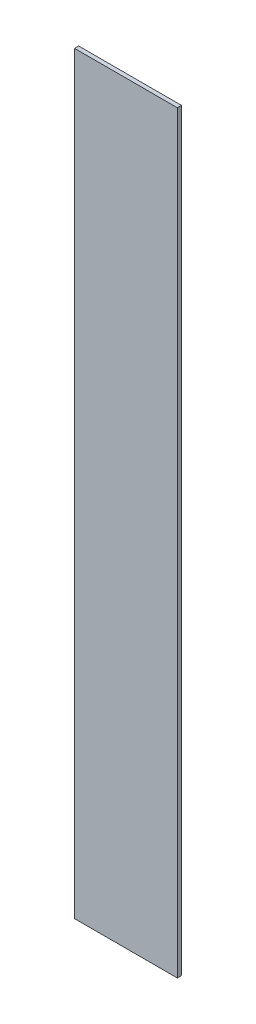
ISO-10303-21;
HEADER;
FILE_DESCRIPTION(('STEP AP214'),'2;1');
FILE_NAME('part.step','',(''),(''),'','','');
FILE_SCHEMA(('AUTOMOTIVE_DESIGN { 1 0 10303 214 1 1 1 1 }'));
ENDSEC;
DATA;
#1=APPLICATION_CONTEXT('core data for automotive mechanical design processes');
#2=APPLICATION_PROTOCOL_DEFINITION('international standard','automotive_design',2000,#1);
#3=PRODUCT_CONTEXT('',#1,'mechanical');
#4=PRODUCT('Part','Part','',(#3));
#5=PRODUCT_RELATED_PRODUCT_CATEGORY('part','',(#4));
#6=PRODUCT_DEFINITION_FORMATION('','',#4);
#7=PRODUCT_DEFINITION_CONTEXT('part definition',#1,'design');
#8=PRODUCT_DEFINITION('design','',#6,#7);
#9=PRODUCT_DEFINITION_SHAPE('','',#8);
#10=(LENGTH_UNIT() NAMED_UNIT(*) SI_UNIT(.MILLI.,.METRE.));
#11=(NAMED_UNIT(*) PLANE_ANGLE_UNIT() SI_UNIT($,.RADIAN.));
#12=(NAMED_UNIT(*) SI_UNIT($,.STERADIAN.) SOLID_ANGLE_UNIT());
#13=UNCERTAINTY_MEASURE_WITH_UNIT(LENGTH_MEASURE(1.E-05),#10,'distance_accuracy_value','');
#14=(GEOMETRIC_REPRESENTATION_CONTEXT(3) GLOBAL_UNCERTAINTY_ASSIGNED_CONTEXT((#13)) GLOBAL_UNIT_ASSIGNED_CONTEXT((#10,
#11,#12)) REPRESENTATION_CONTEXT('',''));
#15=CARTESIAN_POINT('',(0.,0.,0.));
#16=DIRECTION('',(0.,0.,1.));
#17=DIRECTION('',(1.,0.,0.));
#18=AXIS2_PLACEMENT_3D('',#15,#16,#17);
#19=CARTESIAN_POINT('',(15.,110.,1.2));
#20=DIRECTION('',(-1.,0.,0.));
#21=DIRECTION('',(0.,-1.,0.));
#22=AXIS2_PLACEMENT_3D('',#19,#20,#21);
#23=PLANE('',#22);
#24=DIRECTION('',(0.,1.,0.));
#25=VECTOR('',#24,1.);
#26=CARTESIAN_POINT('',(15.,110.,0.));
#27=LINE('',#26,#25);
#28=CARTESIAN_POINT('',(15.,-110.,0.));
#29=VERTEX_POINT('',#28);
#30=CARTESIAN_POINT('',(15.,110.,0.));
#31=VERTEX_POINT('',#30);
#32=EDGE_CURVE('E98',#29,#31,#27,.T.);
#33=ORIENTED_EDGE('',*,*,#32,.T.);
#34=DIRECTION('',(0.,0.,-1.));
#35=VECTOR('',#34,1.);
#36=CARTESIAN_POINT('',(15.,110.,1.2));
#37=LINE('',#36,#35);
#38=CARTESIAN_POINT('',(15.,110.,1.2));
#39=VERTEX_POINT('',#38);
#40=EDGE_CURVE('E11',#39,#31,#37,.T.);
#41=ORIENTED_EDGE('',*,*,#40,.F.);
#42=DIRECTION('',(0.,1.,0.));
#43=VECTOR('',#42,1.);
#44=CARTESIAN_POINT('',(15.,110.,1.2));
#45=LINE('',#44,#43);
#46=CARTESIAN_POINT('',(15.,-110.,1.2));
#47=VERTEX_POINT('',#46);
#48=EDGE_CURVE('E86',#47,#39,#45,.T.);
#49=ORIENTED_EDGE('',*,*,#48,.F.);
#50=DIRECTION('',(0.,0.,-1.));
#51=VECTOR('',#50,1.);
#52=CARTESIAN_POINT('',(15.,-110.,1.2));
#53=LINE('',#52,#51);
#54=EDGE_CURVE('E94',#47,#29,#53,.T.);
#55=ORIENTED_EDGE('',*,*,#54,.T.);
#56=EDGE_LOOP('',(#33,#41,#49,#55));
#57=FACE_BOUND('',#56,.T.);
#58=ADVANCED_FACE('F35',(#57),#23,.F.);
#59=CARTESIAN_POINT('',(-15.,110.,1.2));
#60=DIRECTION('',(0.,-1.,0.));
#61=DIRECTION('',(0.,0.,-1.));
#62=AXIS2_PLACEMENT_3D('',#59,#60,#61);
#63=PLANE('',#62);
#64=DIRECTION('',(-1.,0.,0.));
#65=VECTOR('',#64,1.);
#66=CARTESIAN_POINT('',(-15.,110.,0.));
#67=LINE('',#66,#65);
#68=CARTESIAN_POINT('',(-15.,110.,0.));
#69=VERTEX_POINT('',#68);
#70=EDGE_CURVE('E90',#31,#69,#67,.T.);
#71=ORIENTED_EDGE('',*,*,#70,.T.);
#72=DIRECTION('',(0.,0.,-1.));
#73=VECTOR('',#72,1.);
#74=CARTESIAN_POINT('',(-15.,110.,1.2));
#75=LINE('',#74,#73);
#76=CARTESIAN_POINT('',(-15.,110.,1.2));
#77=VERTEX_POINT('',#76);
#78=EDGE_CURVE('E43',#77,#69,#75,.T.);
#79=ORIENTED_EDGE('',*,*,#78,.F.);
#80=DIRECTION('',(-1.,0.,0.));
#81=VECTOR('',#80,1.);
#82=CARTESIAN_POINT('',(-15.,110.,1.2));
#83=LINE('',#82,#81);
#84=EDGE_CURVE('E81',#39,#77,#83,.T.);
#85=ORIENTED_EDGE('',*,*,#84,.F.);
#86=ORIENTED_EDGE('',*,*,#40,.T.);
#87=EDGE_LOOP('',(#71,#79,#85,#86));
#88=FACE_BOUND('',#87,.T.);
#89=ADVANCED_FACE('F89',(#88),#63,.F.);
#90=CARTESIAN_POINT('',(-15.,110.,1.2));
#91=DIRECTION('',(1.,0.,0.));
#92=DIRECTION('',(0.,1.,0.));
#93=AXIS2_PLACEMENT_3D('',#90,#91,#92);
#94=PLANE('',#93);
#95=DIRECTION('',(0.,-1.,0.));
#96=VECTOR('',#95,1.);
#97=CARTESIAN_POINT('',(-15.,110.,0.));
#98=LINE('',#97,#96);
#99=CARTESIAN_POINT('',(-15.,-110.,0.));
#100=VERTEX_POINT('',#99);
#101=EDGE_CURVE('E68',#69,#100,#98,.T.);
#102=ORIENTED_EDGE('',*,*,#101,.T.);
#103=DIRECTION('',(0.,0.,-1.));
#104=VECTOR('',#103,1.);
#105=CARTESIAN_POINT('',(-15.,-110.,1.2));
#106=LINE('',#105,#104);
#107=CARTESIAN_POINT('',(-15.,-110.,1.2));
#108=VERTEX_POINT('',#107);
#109=EDGE_CURVE('E91',#108,#100,#106,.T.);
#110=ORIENTED_EDGE('',*,*,#109,.F.);
#111=DIRECTION('',(0.,-1.,0.));
#112=VECTOR('',#111,1.);
#113=CARTESIAN_POINT('',(-15.,110.,1.2));
#114=LINE('',#113,#112);
#115=EDGE_CURVE('E84',#77,#108,#114,.T.);
#116=ORIENTED_EDGE('',*,*,#115,.F.);
#117=ORIENTED_EDGE('',*,*,#78,.T.);
#118=EDGE_LOOP('',(#102,#110,#116,#117));
#119=FACE_BOUND('',#118,.T.);
#120=ADVANCED_FACE('F92',(#119),#94,.F.);
#121=CARTESIAN_POINT('',(-15.,-110.,1.2));
#122=DIRECTION('',(0.,1.,0.));
#123=DIRECTION('',(0.,0.,1.));
#124=AXIS2_PLACEMENT_3D('',#121,#122,#123);
#125=PLANE('',#124);
#126=DIRECTION('',(1.,0.,0.));
#127=VECTOR('',#126,1.);
#128=CARTESIAN_POINT('',(-15.,-110.,0.));
#129=LINE('',#128,#127);
#130=EDGE_CURVE('E74',#100,#29,#129,.T.);
#131=ORIENTED_EDGE('',*,*,#130,.T.);
#132=ORIENTED_EDGE('',*,*,#54,.F.);
#133=DIRECTION('',(1.,0.,0.));
#134=VECTOR('',#133,1.);
#135=CARTESIAN_POINT('',(-15.,-110.,1.2));
#136=LINE('',#135,#134);
#137=EDGE_CURVE('E51',#108,#47,#136,.T.);
#138=ORIENTED_EDGE('',*,*,#137,.F.);
#139=ORIENTED_EDGE('',*,*,#109,.T.);
#140=EDGE_LOOP('',(#131,#132,#138,#139));
#141=FACE_BOUND('',#140,.T.);
#142=ADVANCED_FACE('F105',(#141),#125,.F.);
#143=CARTESIAN_POINT('',(0.,0.,1.2));
#144=DIRECTION('',(0.,0.,1.));
#145=DIRECTION('',(1.,0.,0.));
#146=AXIS2_PLACEMENT_3D('',#143,#144,#145);
#147=PLANE('',#146);
#148=ORIENTED_EDGE('',*,*,#48,.T.);
#149=ORIENTED_EDGE('',*,*,#84,.T.);
#150=ORIENTED_EDGE('',*,*,#115,.T.);
#151=ORIENTED_EDGE('',*,*,#137,.T.);
#152=EDGE_LOOP('',(#148,#149,#150,#151));
#153=FACE_BOUND('',#152,.T.);
#154=ADVANCED_FACE('F82',(#153),#147,.T.);
#155=CARTESIAN_POINT('',(0.,0.,0.));
#156=DIRECTION('',(0.,0.,1.));
#157=DIRECTION('',(1.,0.,0.));
#158=AXIS2_PLACEMENT_3D('',#155,#156,#157);
#159=PLANE('',#158);
#160=ORIENTED_EDGE('',*,*,#32,.F.);
#161=ORIENTED_EDGE('',*,*,#130,.F.);
#162=ORIENTED_EDGE('',*,*,#101,.F.);
#163=ORIENTED_EDGE('',*,*,#70,.F.);
#164=EDGE_LOOP('',(#160,#161,#162,#163));
#165=FACE_BOUND('',#164,.T.);
#166=ADVANCED_FACE('F108',(#165),#159,.F.);
#167=CLOSED_SHELL('',(#58,#89,#120,#142,#154,#166));
#168=MANIFOLD_SOLID_BREP('B2',#167);
#169=ADVANCED_BREP_SHAPE_REPRESENTATION('',(#18,#168),#14);
#170=SHAPE_DEFINITION_REPRESENTATION(#9,#169);
ENDSEC;
END-ISO-10303-21;
